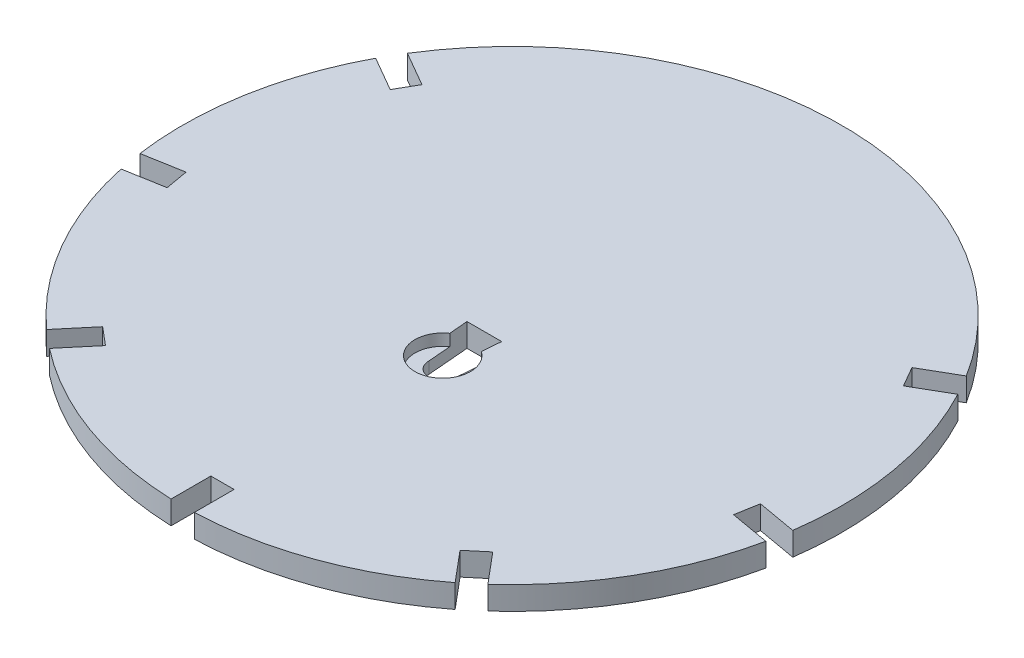
ISO-10303-21;
HEADER;
FILE_DESCRIPTION(('STEP AP214'),'2;1');
FILE_NAME('part.step','',(''),(''),'','','');
FILE_SCHEMA(('AUTOMOTIVE_DESIGN { 1 0 10303 214 1 1 1 1 }'));
ENDSEC;
DATA;
#1=APPLICATION_CONTEXT('core data for automotive mechanical design processes');
#2=APPLICATION_PROTOCOL_DEFINITION('international standard','automotive_design',2000,#1);
#3=PRODUCT_CONTEXT('',#1,'mechanical');
#4=PRODUCT('Part','Part','',(#3));
#5=PRODUCT_RELATED_PRODUCT_CATEGORY('part','',(#4));
#6=PRODUCT_DEFINITION_FORMATION('','',#4);
#7=PRODUCT_DEFINITION_CONTEXT('part definition',#1,'design');
#8=PRODUCT_DEFINITION('design','',#6,#7);
#9=PRODUCT_DEFINITION_SHAPE('','',#8);
#10=(LENGTH_UNIT() NAMED_UNIT(*) SI_UNIT(.MILLI.,.METRE.));
#11=(NAMED_UNIT(*) PLANE_ANGLE_UNIT() SI_UNIT($,.RADIAN.));
#12=(NAMED_UNIT(*) SI_UNIT($,.STERADIAN.) SOLID_ANGLE_UNIT());
#13=UNCERTAINTY_MEASURE_WITH_UNIT(LENGTH_MEASURE(1.E-05),#10,'distance_accuracy_value','');
#14=(GEOMETRIC_REPRESENTATION_CONTEXT(3) GLOBAL_UNCERTAINTY_ASSIGNED_CONTEXT((#13)) GLOBAL_UNIT_ASSIGNED_CONTEXT((#10,
#11,#12)) REPRESENTATION_CONTEXT('',''));
#15=CARTESIAN_POINT('',(0.,0.,0.));
#16=DIRECTION('',(0.,0.,1.));
#17=DIRECTION('',(1.,0.,0.));
#18=AXIS2_PLACEMENT_3D('',#15,#16,#17);
#19=CARTESIAN_POINT('',(0.,0.,20.));
#20=DIRECTION('',(0.,1.,0.));
#21=DIRECTION('',(0.,0.,1.));
#22=AXIS2_PLACEMENT_3D('',#19,#20,#21);
#23=CYLINDRICAL_SURFACE('',#22,4.);
#24=CARTESIAN_POINT('',(0.,3.35,20.));
#25=DIRECTION('',(0.,1.,0.));
#26=DIRECTION('',(0.,0.,1.));
#27=AXIS2_PLACEMENT_3D('',#24,#25,#26);
#28=CIRCLE('',#27,4.);
#29=CARTESIAN_POINT('',(4.,3.35,20.));
#30=VERTEX_POINT('',#29);
#31=CARTESIAN_POINT('',(-4.,3.35,20.));
#32=VERTEX_POINT('',#31);
#33=EDGE_CURVE('E48',#30,#32,#28,.F.);
#34=ORIENTED_EDGE('',*,*,#33,.F.);
#35=DIRECTION('',(0.,1.,0.));
#36=VECTOR('',#35,1.);
#37=CARTESIAN_POINT('',(4.,0.,20.));
#38=LINE('',#37,#36);
#39=CARTESIAN_POINT('',(4.,0.,20.));
#40=VERTEX_POINT('',#39);
#41=EDGE_CURVE('E268',#40,#30,#38,.T.);
#42=ORIENTED_EDGE('',*,*,#41,.F.);
#43=CARTESIAN_POINT('',(0.,0.,20.));
#44=DIRECTION('',(0.,1.,0.));
#45=DIRECTION('',(0.,0.,1.));
#46=AXIS2_PLACEMENT_3D('',#43,#44,#45);
#47=CIRCLE('',#46,4.);
#48=CARTESIAN_POINT('',(-4.,0.,20.));
#49=VERTEX_POINT('',#48);
#50=EDGE_CURVE('E283',#49,#40,#47,.T.);
#51=ORIENTED_EDGE('',*,*,#50,.F.);
#52=DIRECTION('',(0.,1.,0.));
#53=VECTOR('',#52,1.);
#54=CARTESIAN_POINT('',(-4.,0.,20.));
#55=LINE('',#54,#53);
#56=EDGE_CURVE('E464',#49,#32,#55,.T.);
#57=ORIENTED_EDGE('',*,*,#56,.T.);
#58=EDGE_LOOP('',(#34,#42,#51,#57));
#59=FACE_BOUND('',#58,.T.);
#60=ADVANCED_FACE('F33',(#59),#23,.F.);
#61=CARTESIAN_POINT('',(0.,6.7,0.));
#62=DIRECTION('',(0.,-1.,0.));
#63=DIRECTION('',(0.,0.,-1.));
#64=AXIS2_PLACEMENT_3D('',#61,#62,#63);
#65=CYLINDRICAL_SURFACE('',#64,95.);
#66=DIRECTION('',(0.,-1.,0.));
#67=VECTOR('',#66,1.);
#68=CARTESIAN_POINT('',(-58.4605954679749,6.7,74.8822994941381));
#69=LINE('',#68,#67);
#70=CARTESIAN_POINT('',(-58.4605954679749,0.,74.8822994941381));
#71=VERTEX_POINT('',#70);
#72=CARTESIAN_POINT('',(-58.4605954679749,6.7,74.8822994941381));
#73=VERTEX_POINT('',#72);
#74=EDGE_CURVE('E424',#71,#73,#69,.F.);
#75=ORIENTED_EDGE('',*,*,#74,.F.);
#76=CARTESIAN_POINT('',(0.,0.,0.));
#77=DIRECTION('',(0.,1.,0.));
#78=DIRECTION('',(0.,0.,1.));
#79=AXIS2_PLACEMENT_3D('',#76,#77,#78);
#80=CIRCLE('',#79,95.);
#81=CARTESIAN_POINT('',(-3.35000000000002,0.,94.9409158371669));
#82=VERTEX_POINT('',#81);
#83=EDGE_CURVE('E602',#71,#82,#80,.T.);
#84=ORIENTED_EDGE('',*,*,#83,.T.);
#85=DIRECTION('',(0.,-1.,0.));
#86=VECTOR('',#85,1.);
#87=CARTESIAN_POINT('',(-3.35000000000002,6.7,94.9409158371669));
#88=LINE('',#87,#86);
#89=CARTESIAN_POINT('',(-3.35000000000002,6.7,94.9409158371669));
#90=VERTEX_POINT('',#89);
#91=EDGE_CURVE('E406',#82,#90,#88,.F.);
#92=ORIENTED_EDGE('',*,*,#91,.T.);
#93=CARTESIAN_POINT('',(0.,6.7,0.));
#94=DIRECTION('',(0.,1.,0.));
#95=DIRECTION('',(0.,0.,1.));
#96=AXIS2_PLACEMENT_3D('',#93,#94,#95);
#97=CIRCLE('',#96,95.);
#98=EDGE_CURVE('E607',#73,#90,#97,.T.);
#99=ORIENTED_EDGE('',*,*,#98,.F.);
#100=EDGE_LOOP('',(#75,#84,#92,#99));
#101=FACE_BOUND('',#100,.T.);
#102=ADVANCED_FACE('F506',(#101),#65,.T.);
#103=CARTESIAN_POINT('',(-92.9168285993373,0.,19.7854229937441));
#104=VERTEX_POINT('',#103);
#105=CARTESIAN_POINT('',(-63.5930932368721,0.,70.5756225092383));
#106=VERTEX_POINT('',#105);
#107=EDGE_CURVE('E641',#104,#106,#80,.T.);
#108=ORIENTED_EDGE('',*,*,#107,.T.);
#109=DIRECTION('',(0.,-1.,0.));
#110=VECTOR('',#109,1.);
#111=CARTESIAN_POINT('',(-63.5930932368721,6.7,70.5756225092383));
#112=LINE('',#111,#110);
#113=CARTESIAN_POINT('',(-63.5930932368721,6.7,70.5756225092383));
#114=VERTEX_POINT('',#113);
#115=EDGE_CURVE('E421',#106,#114,#112,.F.);
#116=ORIENTED_EDGE('',*,*,#115,.T.);
#117=CARTESIAN_POINT('',(-92.9168285993373,6.7,19.7854229937441));
#118=VERTEX_POINT('',#117);
#119=EDGE_CURVE('E609',#118,#114,#97,.T.);
#120=ORIENTED_EDGE('',*,*,#119,.F.);
#121=DIRECTION('',(0.,-1.,0.));
#122=VECTOR('',#121,1.);
#123=CARTESIAN_POINT('',(-92.9168285993373,6.7,19.7854229937441));
#124=LINE('',#123,#122);
#125=EDGE_CURVE('E419',#104,#118,#124,.F.);
#126=ORIENTED_EDGE('',*,*,#125,.F.);
#127=EDGE_LOOP('',(#108,#116,#120,#126));
#128=FACE_BOUND('',#127,.T.);
#129=ADVANCED_FACE('F511',(#128),#65,.T.);
#130=CARTESIAN_POINT('',(-83.8962449735466,0.,-44.569272815906));
#131=VERTEX_POINT('',#130);
#132=CARTESIAN_POINT('',(-94.0802713897057,0.,13.1872110485623));
#133=VERTEX_POINT('',#132);
#134=EDGE_CURVE('E460',#131,#133,#80,.T.);
#135=ORIENTED_EDGE('',*,*,#134,.T.);
#136=DIRECTION('',(0.,-1.,0.));
#137=VECTOR('',#136,1.);
#138=CARTESIAN_POINT('',(-94.0802713897057,6.7,13.1872110485623));
#139=LINE('',#138,#137);
#140=CARTESIAN_POINT('',(-94.0802713897057,6.7,13.1872110485623));
#141=VERTEX_POINT('',#140);
#142=EDGE_CURVE('E416',#133,#141,#139,.F.);
#143=ORIENTED_EDGE('',*,*,#142,.T.);
#144=CARTESIAN_POINT('',(-83.8962449735466,6.7,-44.569272815906));
#145=VERTEX_POINT('',#144);
#146=EDGE_CURVE('E456',#145,#141,#97,.T.);
#147=ORIENTED_EDGE('',*,*,#146,.F.);
#148=DIRECTION('',(0.,-1.,0.));
#149=VECTOR('',#148,1.);
#150=CARTESIAN_POINT('',(-83.8962449735466,6.7,-44.569272815906));
#151=LINE('',#150,#149);
#152=EDGE_CURVE('E414',#131,#145,#151,.F.);
#153=ORIENTED_EDGE('',*,*,#152,.F.);
#154=EDGE_LOOP('',(#135,#143,#147,#153));
#155=FACE_BOUND('',#154,.T.);
#156=ADVANCED_FACE('F650',(#155),#65,.T.);
#157=DIRECTION('',(0.,-1.,0.));
#158=VECTOR('',#157,1.);
#159=CARTESIAN_POINT('',(3.34999999999998,6.7,94.9409158371669));
#160=LINE('',#159,#158);
#161=CARTESIAN_POINT('',(3.34999999999998,0.,94.9409158371669));
#162=VERTEX_POINT('',#161);
#163=CARTESIAN_POINT('',(3.34999999999998,6.7,94.9409158371669));
#164=VERTEX_POINT('',#163);
#165=EDGE_CURVE('E409',#162,#164,#160,.F.);
#166=ORIENTED_EDGE('',*,*,#165,.F.);
#167=CARTESIAN_POINT('',(58.4605954679749,0.,74.8822994941381));
#168=VERTEX_POINT('',#167);
#169=EDGE_CURVE('E633',#162,#168,#80,.T.);
#170=ORIENTED_EDGE('',*,*,#169,.T.);
#171=DIRECTION('',(0.,-1.,0.));
#172=VECTOR('',#171,1.);
#173=CARTESIAN_POINT('',(58.4605954679749,6.7,74.8822994941381));
#174=LINE('',#173,#172);
#175=CARTESIAN_POINT('',(58.4605954679749,6.7,74.8822994941381));
#176=VERTEX_POINT('',#175);
#177=EDGE_CURVE('E401',#168,#176,#174,.F.);
#178=ORIENTED_EDGE('',*,*,#177,.T.);
#179=EDGE_CURVE('E610',#164,#176,#97,.T.);
#180=ORIENTED_EDGE('',*,*,#179,.F.);
#181=EDGE_LOOP('',(#166,#170,#178,#180));
#182=FACE_BOUND('',#181,.T.);
#183=ADVANCED_FACE('F771',(#182),#65,.T.);
#184=DIRECTION('',(0.,-1.,0.));
#185=VECTOR('',#184,1.);
#186=CARTESIAN_POINT('',(63.5930932368721,6.7,70.5756225092383));
#187=LINE('',#186,#185);
#188=CARTESIAN_POINT('',(63.5930932368721,0.,70.5756225092383));
#189=VERTEX_POINT('',#188);
#190=CARTESIAN_POINT('',(63.5930932368721,6.7,70.5756225092383));
#191=VERTEX_POINT('',#190);
#192=EDGE_CURVE('E404',#189,#191,#187,.F.);
#193=ORIENTED_EDGE('',*,*,#192,.F.);
#194=CARTESIAN_POINT('',(92.9168285993373,0.,19.7854229937441));
#195=VERTEX_POINT('',#194);
#196=EDGE_CURVE('E631',#189,#195,#80,.T.);
#197=ORIENTED_EDGE('',*,*,#196,.T.);
#198=DIRECTION('',(0.,-1.,0.));
#199=VECTOR('',#198,1.);
#200=CARTESIAN_POINT('',(92.9168285993373,6.7,19.7854229937441));
#201=LINE('',#200,#199);
#202=CARTESIAN_POINT('',(92.9168285993373,6.7,19.7854229937441));
#203=VERTEX_POINT('',#202);
#204=EDGE_CURVE('E352',#195,#203,#201,.F.);
#205=ORIENTED_EDGE('',*,*,#204,.T.);
#206=EDGE_CURVE('E613',#191,#203,#97,.T.);
#207=ORIENTED_EDGE('',*,*,#206,.F.);
#208=EDGE_LOOP('',(#193,#197,#205,#207));
#209=FACE_BOUND('',#208,.T.);
#210=ADVANCED_FACE('F763',(#209),#65,.T.);
#211=DIRECTION('',(0.,-1.,0.));
#212=VECTOR('',#211,1.);
#213=CARTESIAN_POINT('',(94.0802713897057,6.7,13.1872110485623));
#214=LINE('',#213,#212);
#215=CARTESIAN_POINT('',(94.0802713897057,0.,13.1872110485623));
#216=VERTEX_POINT('',#215);
#217=CARTESIAN_POINT('',(94.0802713897057,6.7,13.1872110485623));
#218=VERTEX_POINT('',#217);
#219=EDGE_CURVE('E399',#216,#218,#214,.F.);
#220=ORIENTED_EDGE('',*,*,#219,.F.);
#221=CARTESIAN_POINT('',(83.8962449735466,0.,-44.5692728159059));
#222=VERTEX_POINT('',#221);
#223=EDGE_CURVE('E452',#216,#222,#80,.T.);
#224=ORIENTED_EDGE('',*,*,#223,.T.);
#225=DIRECTION('',(0.,-1.,0.));
#226=VECTOR('',#225,1.);
#227=CARTESIAN_POINT('',(83.8962449735466,6.7,-44.5692728159059));
#228=LINE('',#227,#226);
#229=CARTESIAN_POINT('',(83.8962449735466,6.7,-44.5692728159059));
#230=VERTEX_POINT('',#229);
#231=EDGE_CURVE('E447',#222,#230,#228,.F.);
#232=ORIENTED_EDGE('',*,*,#231,.T.);
#233=EDGE_CURVE('E457',#218,#230,#97,.T.);
#234=ORIENTED_EDGE('',*,*,#233,.F.);
#235=EDGE_LOOP('',(#220,#224,#232,#234));
#236=FACE_BOUND('',#235,.T.);
#237=ADVANCED_FACE('F590',(#236),#65,.T.);
#238=CARTESIAN_POINT('',(0.,6.7,0.));
#239=DIRECTION('',(0.,1.,0.));
#240=DIRECTION('',(0.,0.,1.));
#241=AXIS2_PLACEMENT_3D('',#238,#239,#240);
#242=PLANE('',#241);
#243=CARTESIAN_POINT('',(0.,6.7,20.));
#244=DIRECTION('',(0.,1.,0.));
#245=DIRECTION('',(0.,0.,1.));
#246=AXIS2_PLACEMENT_3D('',#243,#244,#245);
#247=CIRCLE('',#246,8.);
#248=CARTESIAN_POINT('',(-4.54843070393989,6.7,13.4188315527213));
#249=VERTEX_POINT('',#248);
#250=CARTESIAN_POINT('',(4.5484307039399,6.7,13.4188315527213));
#251=VERTEX_POINT('',#250);
#252=EDGE_CURVE('E254',#249,#251,#247,.T.);
#253=ORIENTED_EDGE('',*,*,#252,.F.);
#254=DIRECTION('',(-0.0830454798537401,0.,-0.99654575824488));
#255=VECTOR('',#254,1.);
#256=CARTESIAN_POINT('',(-4.,6.7,20.));
#257=LINE('',#256,#255);
#258=CARTESIAN_POINT('',(-5.,6.7,8.));
#259=VERTEX_POINT('',#258);
#260=EDGE_CURVE('E279',#249,#259,#257,.T.);
#261=ORIENTED_EDGE('',*,*,#260,.T.);
#262=DIRECTION('',(1.,0.,0.));
#263=VECTOR('',#262,1.);
#264=CARTESIAN_POINT('',(-5.,6.7,8.));
#265=LINE('',#264,#263);
#266=CARTESIAN_POINT('',(5.,6.7,8.));
#267=VERTEX_POINT('',#266);
#268=EDGE_CURVE('E274',#259,#267,#265,.T.);
#269=ORIENTED_EDGE('',*,*,#268,.T.);
#270=DIRECTION('',(0.0830454798537398,0.,-0.99654575824488));
#271=VECTOR('',#270,1.);
#272=CARTESIAN_POINT('',(4.,6.7,20.));
#273=LINE('',#272,#271);
#274=EDGE_CURVE('E56',#251,#267,#273,.T.);
#275=ORIENTED_EDGE('',*,*,#274,.F.);
#276=EDGE_LOOP('',(#253,#261,#269,#275));
#277=FACE_BOUND('',#276,.T.);
#278=DIRECTION('',(-0.766044443118978,0.,-0.642787609686539));
#279=VECTOR('',#278,1.);
#280=CARTESIAN_POINT('',(-51.0904468341354,6.7,66.0988983818065));
#281=LINE('',#280,#279);
#282=CARTESIAN_POINT('',(-51.0904468341354,6.7,66.0988983818065));
#283=VERTEX_POINT('',#282);
#284=CARTESIAN_POINT('',(-56.2229446030325,6.7,61.7922213969067));
#285=VERTEX_POINT('',#284);
#286=EDGE_CURVE('E307',#283,#285,#281,.T.);
#287=ORIENTED_EDGE('',*,*,#286,.F.);
#288=DIRECTION('',(-0.642787609686541,0.,0.766044443118977));
#289=VECTOR('',#288,1.);
#290=CARTESIAN_POINT('',(-51.0904468341354,6.7,66.0988983818065));
#291=LINE('',#290,#289);
#292=EDGE_CURVE('E301',#283,#73,#291,.T.);
#293=ORIENTED_EDGE('',*,*,#292,.T.);
#294=ORIENTED_EDGE('',*,*,#98,.T.);
#295=DIRECTION('',(0.,0.,1.));
#296=VECTOR('',#295,1.);
#297=CARTESIAN_POINT('',(-3.35000000000002,6.7,83.475));
#298=LINE('',#297,#296);
#299=CARTESIAN_POINT('',(-3.35000000000002,6.7,83.475));
#300=VERTEX_POINT('',#299);
#301=EDGE_CURVE('E386',#300,#90,#298,.T.);
#302=ORIENTED_EDGE('',*,*,#301,.F.);
#303=DIRECTION('',(-1.,0.,0.));
#304=VECTOR('',#303,1.);
#305=CARTESIAN_POINT('',(3.34999999999997,6.7,83.475));
#306=LINE('',#305,#304);
#307=CARTESIAN_POINT('',(3.34999999999997,6.7,83.475));
#308=VERTEX_POINT('',#307);
#309=EDGE_CURVE('E364',#308,#300,#306,.T.);
#310=ORIENTED_EDGE('',*,*,#309,.F.);
#311=DIRECTION('',(0.,0.,1.));
#312=VECTOR('',#311,1.);
#313=CARTESIAN_POINT('',(3.34999999999997,6.7,83.475));
#314=LINE('',#313,#312);
#315=EDGE_CURVE('E383',#308,#164,#314,.T.);
#316=ORIENTED_EDGE('',*,*,#315,.T.);
#317=ORIENTED_EDGE('',*,*,#179,.T.);
#318=DIRECTION('',(0.642787609686541,0.,0.766044443118977));
#319=VECTOR('',#318,1.);
#320=CARTESIAN_POINT('',(51.0904468341354,6.7,66.0988983818065));
#321=LINE('',#320,#319);
#322=CARTESIAN_POINT('',(51.0904468341354,6.7,66.0988983818065));
#323=VERTEX_POINT('',#322);
#324=EDGE_CURVE('E368',#323,#176,#321,.T.);
#325=ORIENTED_EDGE('',*,*,#324,.F.);
#326=DIRECTION('',(-0.766044443118978,0.,0.642787609686539));
#327=VECTOR('',#326,1.);
#328=CARTESIAN_POINT('',(56.2229446030325,6.7,61.7922213969067));
#329=LINE('',#328,#327);
#330=CARTESIAN_POINT('',(56.2229446030325,6.7,61.7922213969067));
#331=VERTEX_POINT('',#330);
#332=EDGE_CURVE('E342',#331,#323,#329,.T.);
#333=ORIENTED_EDGE('',*,*,#332,.F.);
#334=DIRECTION('',(0.642787609686541,0.,0.766044443118976));
#335=VECTOR('',#334,1.);
#336=CARTESIAN_POINT('',(56.2229446030325,6.7,61.7922213969067));
#337=LINE('',#336,#335);
#338=EDGE_CURVE('E365',#331,#191,#337,.T.);
#339=ORIENTED_EDGE('',*,*,#338,.T.);
#340=ORIENTED_EDGE('',*,*,#206,.T.);
#341=DIRECTION('',(0.984807753012209,0.,0.173648177666927));
#342=VECTOR('',#341,1.);
#343=CARTESIAN_POINT('',(81.6251057875099,6.7,17.7943876033377));
#344=LINE('',#343,#342);
#345=CARTESIAN_POINT('',(81.6251057875099,6.7,17.7943876033377));
#346=VERTEX_POINT('',#345);
#347=EDGE_CURVE('E346',#346,#203,#344,.T.);
#348=ORIENTED_EDGE('',*,*,#347,.F.);
#349=DIRECTION('',(-0.173648177666929,0.,0.984807753012208));
#350=VECTOR('',#349,1.);
#351=CARTESIAN_POINT('',(82.7885485778783,6.7,11.1961756581559));
#352=LINE('',#351,#350);
#353=CARTESIAN_POINT('',(82.7885485778783,6.7,11.1961756581559));
#354=VERTEX_POINT('',#353);
#355=EDGE_CURVE('E349',#354,#346,#352,.T.);
#356=ORIENTED_EDGE('',*,*,#355,.F.);
#357=DIRECTION('',(0.984807753012208,0.,0.173648177666927));
#358=VECTOR('',#357,1.);
#359=CARTESIAN_POINT('',(82.7885485778783,6.7,11.1961756581559));
#360=LINE('',#359,#358);
#361=EDGE_CURVE('E343',#354,#218,#360,.T.);
#362=ORIENTED_EDGE('',*,*,#361,.T.);
#363=ORIENTED_EDGE('',*,*,#233,.T.);
#364=DIRECTION('',(0.866025403784436,0.,-0.500000000000004));
#365=VECTOR('',#364,1.);
#366=CARTESIAN_POINT('',(73.9664705809058,6.7,-38.8363148973225));
#367=LINE('',#366,#365);
#368=CARTESIAN_POINT('',(73.9664705809058,6.7,-38.8363148973225));
#369=VERTEX_POINT('',#368);
#370=EDGE_CURVE('E439',#369,#230,#367,.T.);
#371=ORIENTED_EDGE('',*,*,#370,.F.);
#372=DIRECTION('',(0.500000000000003,0.,0.866025403784437));
#373=VECTOR('',#372,1.);
#374=CARTESIAN_POINT('',(70.6164705809058,6.7,-44.6386851026782));
#375=LINE('',#374,#373);
#376=CARTESIAN_POINT('',(70.6164705809058,6.7,-44.6386851026782));
#377=VERTEX_POINT('',#376);
#378=EDGE_CURVE('E430',#377,#369,#375,.T.);
#379=ORIENTED_EDGE('',*,*,#378,.F.);
#380=DIRECTION('',(0.866025403784436,0.,-0.500000000000004));
#381=VECTOR('',#380,1.);
#382=CARTESIAN_POINT('',(70.6164705809058,6.7,-44.6386851026782));
#383=LINE('',#382,#381);
#384=CARTESIAN_POINT('',(80.5462449735466,6.7,-50.3716430212617));
#385=VERTEX_POINT('',#384);
#386=EDGE_CURVE('E426',#377,#385,#383,.T.);
#387=ORIENTED_EDGE('',*,*,#386,.T.);
#388=CARTESIAN_POINT('',(-80.5462449735466,6.7,-50.3716430212617));
#389=VERTEX_POINT('',#388);
#390=EDGE_CURVE('E453',#385,#389,#97,.T.);
#391=ORIENTED_EDGE('',*,*,#390,.T.);
#392=DIRECTION('',(-0.866025403784436,0.,-0.500000000000004));
#393=VECTOR('',#392,1.);
#394=CARTESIAN_POINT('',(-70.6164705809058,6.7,-44.6386851026782));
#395=LINE('',#394,#393);
#396=CARTESIAN_POINT('',(-70.6164705809058,6.7,-44.6386851026782));
#397=VERTEX_POINT('',#396);
#398=EDGE_CURVE('E490',#397,#389,#395,.T.);
#399=ORIENTED_EDGE('',*,*,#398,.F.);
#400=DIRECTION('',(0.500000000000005,0.,-0.866025403784436));
#401=VECTOR('',#400,1.);
#402=CARTESIAN_POINT('',(-73.9664705809058,6.7,-38.8363148973225));
#403=LINE('',#402,#401);
#404=CARTESIAN_POINT('',(-73.9664705809058,6.7,-38.8363148973225));
#405=VERTEX_POINT('',#404);
#406=EDGE_CURVE('E322',#405,#397,#403,.T.);
#407=ORIENTED_EDGE('',*,*,#406,.F.);
#408=DIRECTION('',(-0.866025403784436,0.,-0.500000000000004));
#409=VECTOR('',#408,1.);
#410=CARTESIAN_POINT('',(-73.9664705809058,6.7,-38.8363148973225));
#411=LINE('',#410,#409);
#412=EDGE_CURVE('E482',#405,#145,#411,.T.);
#413=ORIENTED_EDGE('',*,*,#412,.T.);
#414=ORIENTED_EDGE('',*,*,#146,.T.);
#415=DIRECTION('',(-0.984807753012209,0.,0.173648177666928));
#416=VECTOR('',#415,1.);
#417=CARTESIAN_POINT('',(-82.7885485778783,6.7,11.1961756581559));
#418=LINE('',#417,#416);
#419=CARTESIAN_POINT('',(-82.7885485778783,6.7,11.1961756581559));
#420=VERTEX_POINT('',#419);
#421=EDGE_CURVE('E326',#420,#141,#418,.T.);
#422=ORIENTED_EDGE('',*,*,#421,.F.);
#423=DIRECTION('',(-0.173648177666927,0.,-0.984807753012209));
#424=VECTOR('',#423,1.);
#425=CARTESIAN_POINT('',(-81.6251057875099,6.7,17.7943876033377));
#426=LINE('',#425,#424);
#427=CARTESIAN_POINT('',(-81.6251057875099,6.7,17.7943876033377));
#428=VERTEX_POINT('',#427);
#429=EDGE_CURVE('E300',#428,#420,#426,.T.);
#430=ORIENTED_EDGE('',*,*,#429,.F.);
#431=DIRECTION('',(-0.984807753012209,0.,0.173648177666928));
#432=VECTOR('',#431,1.);
#433=CARTESIAN_POINT('',(-81.6251057875099,6.7,17.7943876033377));
#434=LINE('',#433,#432);
#435=EDGE_CURVE('E323',#428,#118,#434,.T.);
#436=ORIENTED_EDGE('',*,*,#435,.T.);
#437=ORIENTED_EDGE('',*,*,#119,.T.);
#438=DIRECTION('',(-0.64278760968654,0.,0.766044443118977));
#439=VECTOR('',#438,1.);
#440=CARTESIAN_POINT('',(-56.2229446030325,6.7,61.7922213969067));
#441=LINE('',#440,#439);
#442=EDGE_CURVE('E304',#285,#114,#441,.T.);
#443=ORIENTED_EDGE('',*,*,#442,.F.);
#444=EDGE_LOOP('',(#287,#293,#294,#302,#310,#316,#317,#325,#333,#339,#340,#348,#356,#362,#363,
#371,#379,#387,#391,#399,#407,#413,#414,#422,#430,#436,#437,#443));
#445=FACE_BOUND('',#444,.T.);
#446=ADVANCED_FACE('F271',(#277,#445),#242,.T.);
#447=CARTESIAN_POINT('',(0.,0.,0.));
#448=DIRECTION('',(0.,1.,0.));
#449=DIRECTION('',(0.,0.,1.));
#450=AXIS2_PLACEMENT_3D('',#447,#448,#449);
#451=PLANE('',#450);
#452=ORIENTED_EDGE('',*,*,#50,.T.);
#453=DIRECTION('',(0.0830454798537398,0.,-0.99654575824488));
#454=VECTOR('',#453,1.);
#455=CARTESIAN_POINT('',(4.,0.,20.));
#456=LINE('',#455,#454);
#457=CARTESIAN_POINT('',(5.,0.,8.));
#458=VERTEX_POINT('',#457);
#459=EDGE_CURVE('E292',#40,#458,#456,.T.);
#460=ORIENTED_EDGE('',*,*,#459,.T.);
#461=DIRECTION('',(1.,0.,0.));
#462=VECTOR('',#461,1.);
#463=CARTESIAN_POINT('',(-5.,0.,8.));
#464=LINE('',#463,#462);
#465=CARTESIAN_POINT('',(-5.,0.,8.));
#466=VERTEX_POINT('',#465);
#467=EDGE_CURVE('E290',#466,#458,#464,.T.);
#468=ORIENTED_EDGE('',*,*,#467,.F.);
#469=DIRECTION('',(-0.0830454798537401,0.,-0.99654575824488));
#470=VECTOR('',#469,1.);
#471=CARTESIAN_POINT('',(-4.,0.,20.));
#472=LINE('',#471,#470);
#473=EDGE_CURVE('E286',#49,#466,#472,.T.);
#474=ORIENTED_EDGE('',*,*,#473,.F.);
#475=EDGE_LOOP('',(#452,#460,#468,#474));
#476=FACE_BOUND('',#475,.T.);
#477=DIRECTION('',(-0.642787609686541,0.,0.766044443118977));
#478=VECTOR('',#477,1.);
#479=CARTESIAN_POINT('',(-51.0904468341354,0.,66.0988983818065));
#480=LINE('',#479,#478);
#481=CARTESIAN_POINT('',(-51.0904468341354,0.,66.0988983818065));
#482=VERTEX_POINT('',#481);
#483=EDGE_CURVE('E297',#482,#71,#480,.T.);
#484=ORIENTED_EDGE('',*,*,#483,.F.);
#485=DIRECTION('',(-0.766044443118978,0.,-0.642787609686539));
#486=VECTOR('',#485,1.);
#487=CARTESIAN_POINT('',(-51.0904468341354,0.,66.0988983818065));
#488=LINE('',#487,#486);
#489=CARTESIAN_POINT('',(-56.2229446030325,0.,61.7922213969067));
#490=VERTEX_POINT('',#489);
#491=EDGE_CURVE('E305',#482,#490,#488,.T.);
#492=ORIENTED_EDGE('',*,*,#491,.T.);
#493=DIRECTION('',(-0.64278760968654,0.,0.766044443118977));
#494=VECTOR('',#493,1.);
#495=CARTESIAN_POINT('',(-56.2229446030325,0.,61.7922213969067));
#496=LINE('',#495,#494);
#497=EDGE_CURVE('E312',#490,#106,#496,.T.);
#498=ORIENTED_EDGE('',*,*,#497,.T.);
#499=ORIENTED_EDGE('',*,*,#107,.F.);
#500=DIRECTION('',(-0.984807753012209,0.,0.173648177666928));
#501=VECTOR('',#500,1.);
#502=CARTESIAN_POINT('',(-81.6251057875099,0.,17.7943876033377));
#503=LINE('',#502,#501);
#504=CARTESIAN_POINT('',(-81.6251057875099,0.,17.7943876033377));
#505=VERTEX_POINT('',#504);
#506=EDGE_CURVE('E319',#505,#104,#503,.T.);
#507=ORIENTED_EDGE('',*,*,#506,.F.);
#508=DIRECTION('',(-0.173648177666927,0.,-0.984807753012209));
#509=VECTOR('',#508,1.);
#510=CARTESIAN_POINT('',(-81.6251057875099,0.,17.7943876033377));
#511=LINE('',#510,#509);
#512=CARTESIAN_POINT('',(-82.7885485778783,0.,11.1961756581559));
#513=VERTEX_POINT('',#512);
#514=EDGE_CURVE('E327',#505,#513,#511,.T.);
#515=ORIENTED_EDGE('',*,*,#514,.T.);
#516=DIRECTION('',(-0.984807753012209,0.,0.173648177666928));
#517=VECTOR('',#516,1.);
#518=CARTESIAN_POINT('',(-82.7885485778783,0.,11.1961756581559));
#519=LINE('',#518,#517);
#520=EDGE_CURVE('E332',#513,#133,#519,.T.);
#521=ORIENTED_EDGE('',*,*,#520,.T.);
#522=ORIENTED_EDGE('',*,*,#134,.F.);
#523=DIRECTION('',(-0.866025403784436,0.,-0.500000000000004));
#524=VECTOR('',#523,1.);
#525=CARTESIAN_POINT('',(-73.9664705809058,0.,-38.8363148973225));
#526=LINE('',#525,#524);
#527=CARTESIAN_POINT('',(-73.9664705809058,0.,-38.8363148973225));
#528=VERTEX_POINT('',#527);
#529=EDGE_CURVE('E486',#528,#131,#526,.T.);
#530=ORIENTED_EDGE('',*,*,#529,.F.);
#531=DIRECTION('',(0.500000000000005,0.,-0.866025403784436));
#532=VECTOR('',#531,1.);
#533=CARTESIAN_POINT('',(-73.9664705809058,0.,-38.8363148973225));
#534=LINE('',#533,#532);
#535=CARTESIAN_POINT('',(-70.6164705809058,0.,-44.6386851026782));
#536=VERTEX_POINT('',#535);
#537=EDGE_CURVE('E479',#528,#536,#534,.T.);
#538=ORIENTED_EDGE('',*,*,#537,.T.);
#539=DIRECTION('',(-0.866025403784436,0.,-0.500000000000004));
#540=VECTOR('',#539,1.);
#541=CARTESIAN_POINT('',(-70.6164705809058,0.,-44.6386851026782));
#542=LINE('',#541,#540);
#543=CARTESIAN_POINT('',(-80.5462449735466,0.,-50.3716430212617));
#544=VERTEX_POINT('',#543);
#545=EDGE_CURVE('E483',#536,#544,#542,.T.);
#546=ORIENTED_EDGE('',*,*,#545,.T.);
#547=CARTESIAN_POINT('',(80.5462449735466,0.,-50.3716430212617));
#548=VERTEX_POINT('',#547);
#549=EDGE_CURVE('E458',#548,#544,#80,.T.);
#550=ORIENTED_EDGE('',*,*,#549,.F.);
#551=DIRECTION('',(0.866025403784436,0.,-0.500000000000004));
#552=VECTOR('',#551,1.);
#553=CARTESIAN_POINT('',(70.6164705809058,0.,-44.6386851026782));
#554=LINE('',#553,#552);
#555=CARTESIAN_POINT('',(70.6164705809058,0.,-44.6386851026782));
#556=VERTEX_POINT('',#555);
#557=EDGE_CURVE('E427',#556,#548,#554,.T.);
#558=ORIENTED_EDGE('',*,*,#557,.F.);
#559=DIRECTION('',(0.500000000000003,0.,0.866025403784437));
#560=VECTOR('',#559,1.);
#561=CARTESIAN_POINT('',(70.6164705809058,0.,-44.6386851026782));
#562=LINE('',#561,#560);
#563=CARTESIAN_POINT('',(73.9664705809058,0.,-38.8363148973225));
#564=VERTEX_POINT('',#563);
#565=EDGE_CURVE('E433',#556,#564,#562,.T.);
#566=ORIENTED_EDGE('',*,*,#565,.T.);
#567=DIRECTION('',(0.866025403784436,0.,-0.500000000000004));
#568=VECTOR('',#567,1.);
#569=CARTESIAN_POINT('',(73.9664705809058,0.,-38.8363148973225));
#570=LINE('',#569,#568);
#571=EDGE_CURVE('E429',#564,#222,#570,.T.);
#572=ORIENTED_EDGE('',*,*,#571,.T.);
#573=ORIENTED_EDGE('',*,*,#223,.F.);
#574=DIRECTION('',(0.984807753012208,0.,0.173648177666927));
#575=VECTOR('',#574,1.);
#576=CARTESIAN_POINT('',(82.7885485778783,0.,11.1961756581559));
#577=LINE('',#576,#575);
#578=CARTESIAN_POINT('',(82.7885485778783,0.,11.1961756581559));
#579=VERTEX_POINT('',#578);
#580=EDGE_CURVE('E339',#579,#216,#577,.T.);
#581=ORIENTED_EDGE('',*,*,#580,.F.);
#582=DIRECTION('',(-0.173648177666929,0.,0.984807753012208));
#583=VECTOR('',#582,1.);
#584=CARTESIAN_POINT('',(82.7885485778783,0.,11.1961756581559));
#585=LINE('',#584,#583);
#586=CARTESIAN_POINT('',(81.6251057875099,0.,17.7943876033377));
#587=VERTEX_POINT('',#586);
#588=EDGE_CURVE('E347',#579,#587,#585,.T.);
#589=ORIENTED_EDGE('',*,*,#588,.T.);
#590=DIRECTION('',(0.984807753012209,0.,0.173648177666927));
#591=VECTOR('',#590,1.);
#592=CARTESIAN_POINT('',(81.6251057875099,0.,17.7943876033377));
#593=LINE('',#592,#591);
#594=EDGE_CURVE('E354',#587,#195,#593,.T.);
#595=ORIENTED_EDGE('',*,*,#594,.T.);
#596=ORIENTED_EDGE('',*,*,#196,.F.);
#597=DIRECTION('',(0.642787609686541,0.,0.766044443118976));
#598=VECTOR('',#597,1.);
#599=CARTESIAN_POINT('',(56.2229446030325,0.,61.7922213969067));
#600=LINE('',#599,#598);
#601=CARTESIAN_POINT('',(56.2229446030325,0.,61.7922213969067));
#602=VERTEX_POINT('',#601);
#603=EDGE_CURVE('E361',#602,#189,#600,.T.);
#604=ORIENTED_EDGE('',*,*,#603,.F.);
#605=DIRECTION('',(-0.766044443118978,0.,0.642787609686539));
#606=VECTOR('',#605,1.);
#607=CARTESIAN_POINT('',(56.2229446030325,0.,61.7922213969067));
#608=LINE('',#607,#606);
#609=CARTESIAN_POINT('',(51.0904468341354,0.,66.0988983818065));
#610=VERTEX_POINT('',#609);
#611=EDGE_CURVE('E369',#602,#610,#608,.T.);
#612=ORIENTED_EDGE('',*,*,#611,.T.);
#613=DIRECTION('',(0.642787609686541,0.,0.766044443118977));
#614=VECTOR('',#613,1.);
#615=CARTESIAN_POINT('',(51.0904468341354,0.,66.0988983818065));
#616=LINE('',#615,#614);
#617=EDGE_CURVE('E374',#610,#168,#616,.T.);
#618=ORIENTED_EDGE('',*,*,#617,.T.);
#619=ORIENTED_EDGE('',*,*,#169,.F.);
#620=DIRECTION('',(0.,0.,1.));
#621=VECTOR('',#620,1.);
#622=CARTESIAN_POINT('',(3.34999999999997,0.,83.475));
#623=LINE('',#622,#621);
#624=CARTESIAN_POINT('',(3.34999999999997,0.,83.475));
#625=VERTEX_POINT('',#624);
#626=EDGE_CURVE('E381',#625,#162,#623,.T.);
#627=ORIENTED_EDGE('',*,*,#626,.F.);
#628=DIRECTION('',(-1.,0.,0.));
#629=VECTOR('',#628,1.);
#630=CARTESIAN_POINT('',(3.34999999999997,0.,83.475));
#631=LINE('',#630,#629);
#632=CARTESIAN_POINT('',(-3.35000000000002,0.,83.475));
#633=VERTEX_POINT('',#632);
#634=EDGE_CURVE('E387',#625,#633,#631,.T.);
#635=ORIENTED_EDGE('',*,*,#634,.T.);
#636=DIRECTION('',(0.,0.,1.));
#637=VECTOR('',#636,1.);
#638=CARTESIAN_POINT('',(-3.35000000000002,0.,83.475));
#639=LINE('',#638,#637);
#640=EDGE_CURVE('E392',#633,#82,#639,.T.);
#641=ORIENTED_EDGE('',*,*,#640,.T.);
#642=ORIENTED_EDGE('',*,*,#83,.F.);
#643=EDGE_LOOP('',(#484,#492,#498,#499,#507,#515,#521,#522,#530,#538,#546,#550,#558,#566,#572,
#573,#581,#589,#595,#596,#604,#612,#618,#619,#627,#635,#641,#642));
#644=FACE_BOUND('',#643,.T.);
#645=ADVANCED_FACE('F589',(#476,#644),#451,.F.);
#646=ORIENTED_EDGE('',*,*,#549,.T.);
#647=DIRECTION('',(0.,-1.,0.));
#648=VECTOR('',#647,1.);
#649=CARTESIAN_POINT('',(-80.5462449735466,6.7,-50.3716430212617));
#650=LINE('',#649,#648);
#651=EDGE_CURVE('E411',#544,#389,#650,.F.);
#652=ORIENTED_EDGE('',*,*,#651,.T.);
#653=ORIENTED_EDGE('',*,*,#390,.F.);
#654=DIRECTION('',(0.,-1.,0.));
#655=VECTOR('',#654,1.);
#656=CARTESIAN_POINT('',(80.5462449735466,6.7,-50.3716430212617));
#657=LINE('',#656,#655);
#658=EDGE_CURVE('E450',#548,#385,#657,.F.);
#659=ORIENTED_EDGE('',*,*,#658,.F.);
#660=EDGE_LOOP('',(#646,#652,#653,#659));
#661=FACE_BOUND('',#660,.T.);
#662=ADVANCED_FACE('F35',(#661),#65,.T.);
#663=CARTESIAN_POINT('',(70.6164705809058,0.,-44.6386851026782));
#664=DIRECTION('',(0.500000000000004,0.,0.866025403784436));
#665=DIRECTION('',(0.866025403784436,0.,-0.500000000000004));
#666=AXIS2_PLACEMENT_3D('',#663,#664,#665);
#667=PLANE('',#666);
#668=ORIENTED_EDGE('',*,*,#658,.T.);
#669=ORIENTED_EDGE('',*,*,#386,.F.);
#670=DIRECTION('',(0.,1.,0.));
#671=VECTOR('',#670,1.);
#672=CARTESIAN_POINT('',(70.6164705809058,0.,-44.6386851026782));
#673=LINE('',#672,#671);
#674=EDGE_CURVE('E436',#556,#377,#673,.T.);
#675=ORIENTED_EDGE('',*,*,#674,.F.);
#676=ORIENTED_EDGE('',*,*,#557,.T.);
#677=EDGE_LOOP('',(#668,#669,#675,#676));
#678=FACE_BOUND('',#677,.T.);
#679=ADVANCED_FACE('F583',(#678),#667,.T.);
#680=CARTESIAN_POINT('',(73.9664705809058,0.,-38.8363148973225));
#681=DIRECTION('',(0.500000000000004,0.,0.866025403784436));
#682=DIRECTION('',(0.866025403784436,0.,-0.500000000000004));
#683=AXIS2_PLACEMENT_3D('',#680,#681,#682);
#684=PLANE('',#683);
#685=ORIENTED_EDGE('',*,*,#571,.F.);
#686=DIRECTION('',(0.,1.,0.));
#687=VECTOR('',#686,1.);
#688=CARTESIAN_POINT('',(73.9664705809058,0.,-38.8363148973225));
#689=LINE('',#688,#687);
#690=EDGE_CURVE('E445',#564,#369,#689,.T.);
#691=ORIENTED_EDGE('',*,*,#690,.T.);
#692=ORIENTED_EDGE('',*,*,#370,.T.);
#693=ORIENTED_EDGE('',*,*,#231,.F.);
#694=EDGE_LOOP('',(#685,#691,#692,#693));
#695=FACE_BOUND('',#694,.T.);
#696=ADVANCED_FACE('F579',(#695),#684,.F.);
#697=CARTESIAN_POINT('',(70.6164705809058,0.,-44.6386851026782));
#698=DIRECTION('',(-0.866025403784437,0.,0.500000000000003));
#699=DIRECTION('',(0.500000000000003,0.,0.866025403784437));
#700=AXIS2_PLACEMENT_3D('',#697,#698,#699);
#701=PLANE('',#700);
#702=ORIENTED_EDGE('',*,*,#378,.T.);
#703=ORIENTED_EDGE('',*,*,#690,.F.);
#704=ORIENTED_EDGE('',*,*,#565,.F.);
#705=ORIENTED_EDGE('',*,*,#674,.T.);
#706=EDGE_LOOP('',(#702,#703,#704,#705));
#707=FACE_BOUND('',#706,.T.);
#708=ADVANCED_FACE('F552',(#707),#701,.F.);
#709=CARTESIAN_POINT('',(82.7885485778783,0.,11.1961756581559));
#710=DIRECTION('',(-0.173648177666927,0.,0.984807753012209));
#711=DIRECTION('',(0.984807753012209,0.,0.173648177666927));
#712=AXIS2_PLACEMENT_3D('',#709,#710,#711);
#713=PLANE('',#712);
#714=ORIENTED_EDGE('',*,*,#219,.T.);
#715=ORIENTED_EDGE('',*,*,#361,.F.);
#716=DIRECTION('',(0.,1.,0.));
#717=VECTOR('',#716,1.);
#718=CARTESIAN_POINT('',(82.7885485778783,0.,11.1961756581559));
#719=LINE('',#718,#717);
#720=EDGE_CURVE('E340',#579,#354,#719,.T.);
#721=ORIENTED_EDGE('',*,*,#720,.F.);
#722=ORIENTED_EDGE('',*,*,#580,.T.);
#723=EDGE_LOOP('',(#714,#715,#721,#722));
#724=FACE_BOUND('',#723,.T.);
#725=ADVANCED_FACE('F548',(#724),#713,.T.);
#726=CARTESIAN_POINT('',(81.6251057875099,0.,17.7943876033377));
#727=DIRECTION('',(-0.173648177666927,0.,0.984807753012209));
#728=DIRECTION('',(0.984807753012209,0.,0.173648177666927));
#729=AXIS2_PLACEMENT_3D('',#726,#727,#728);
#730=PLANE('',#729);
#731=ORIENTED_EDGE('',*,*,#594,.F.);
#732=DIRECTION('',(0.,1.,0.));
#733=VECTOR('',#732,1.);
#734=CARTESIAN_POINT('',(81.6251057875099,0.,17.7943876033377));
#735=LINE('',#734,#733);
#736=EDGE_CURVE('E337',#587,#346,#735,.T.);
#737=ORIENTED_EDGE('',*,*,#736,.T.);
#738=ORIENTED_EDGE('',*,*,#347,.T.);
#739=ORIENTED_EDGE('',*,*,#204,.F.);
#740=EDGE_LOOP('',(#731,#737,#738,#739));
#741=FACE_BOUND('',#740,.T.);
#742=ADVANCED_FACE('F544',(#741),#730,.F.);
#743=CARTESIAN_POINT('',(82.7885485778783,0.,11.1961756581559));
#744=DIRECTION('',(-0.984807753012208,0.,-0.173648177666929));
#745=DIRECTION('',(-0.173648177666929,0.,0.984807753012208));
#746=AXIS2_PLACEMENT_3D('',#743,#744,#745);
#747=PLANE('',#746);
#748=ORIENTED_EDGE('',*,*,#355,.T.);
#749=ORIENTED_EDGE('',*,*,#736,.F.);
#750=ORIENTED_EDGE('',*,*,#588,.F.);
#751=ORIENTED_EDGE('',*,*,#720,.T.);
#752=EDGE_LOOP('',(#748,#749,#750,#751));
#753=FACE_BOUND('',#752,.T.);
#754=ADVANCED_FACE('F540',(#753),#747,.F.);
#755=CARTESIAN_POINT('',(56.2229446030325,0.,61.7922213969067));
#756=DIRECTION('',(-0.766044443118977,0.,0.642787609686541));
#757=DIRECTION('',(0.642787609686541,0.,0.766044443118977));
#758=AXIS2_PLACEMENT_3D('',#755,#756,#757);
#759=PLANE('',#758);
#760=ORIENTED_EDGE('',*,*,#192,.T.);
#761=ORIENTED_EDGE('',*,*,#338,.F.);
#762=DIRECTION('',(0.,1.,0.));
#763=VECTOR('',#762,1.);
#764=CARTESIAN_POINT('',(56.2229446030325,0.,61.7922213969067));
#765=LINE('',#764,#763);
#766=EDGE_CURVE('E362',#602,#331,#765,.T.);
#767=ORIENTED_EDGE('',*,*,#766,.F.);
#768=ORIENTED_EDGE('',*,*,#603,.T.);
#769=EDGE_LOOP('',(#760,#761,#767,#768));
#770=FACE_BOUND('',#769,.T.);
#771=ADVANCED_FACE('F543',(#770),#759,.T.);
#772=CARTESIAN_POINT('',(51.0904468341354,0.,66.0988983818065));
#773=DIRECTION('',(-0.766044443118977,0.,0.642787609686541));
#774=DIRECTION('',(0.642787609686541,0.,0.766044443118977));
#775=AXIS2_PLACEMENT_3D('',#772,#773,#774);
#776=PLANE('',#775);
#777=ORIENTED_EDGE('',*,*,#617,.F.);
#778=DIRECTION('',(0.,1.,0.));
#779=VECTOR('',#778,1.);
#780=CARTESIAN_POINT('',(51.0904468341354,0.,66.0988983818065));
#781=LINE('',#780,#779);
#782=EDGE_CURVE('E359',#610,#323,#781,.T.);
#783=ORIENTED_EDGE('',*,*,#782,.T.);
#784=ORIENTED_EDGE('',*,*,#324,.T.);
#785=ORIENTED_EDGE('',*,*,#177,.F.);
#786=EDGE_LOOP('',(#777,#783,#784,#785));
#787=FACE_BOUND('',#786,.T.);
#788=ADVANCED_FACE('F558',(#787),#776,.F.);
#789=CARTESIAN_POINT('',(56.2229446030325,0.,61.7922213969067));
#790=DIRECTION('',(-0.642787609686539,0.,-0.766044443118978));
#791=DIRECTION('',(-0.766044443118978,0.,0.642787609686539));
#792=AXIS2_PLACEMENT_3D('',#789,#790,#791);
#793=PLANE('',#792);
#794=ORIENTED_EDGE('',*,*,#332,.T.);
#795=ORIENTED_EDGE('',*,*,#782,.F.);
#796=ORIENTED_EDGE('',*,*,#611,.F.);
#797=ORIENTED_EDGE('',*,*,#766,.T.);
#798=EDGE_LOOP('',(#794,#795,#796,#797));
#799=FACE_BOUND('',#798,.T.);
#800=ADVANCED_FACE('F554',(#799),#793,.F.);
#801=CARTESIAN_POINT('',(3.34999999999997,0.,83.475));
#802=DIRECTION('',(-1.,0.,0.));
#803=DIRECTION('',(0.,0.,1.));
#804=AXIS2_PLACEMENT_3D('',#801,#802,#803);
#805=PLANE('',#804);
#806=ORIENTED_EDGE('',*,*,#165,.T.);
#807=ORIENTED_EDGE('',*,*,#315,.F.);
#808=DIRECTION('',(0.,1.,0.));
#809=VECTOR('',#808,1.);
#810=CARTESIAN_POINT('',(3.34999999999997,0.,83.475));
#811=LINE('',#810,#809);
#812=EDGE_CURVE('E310',#625,#308,#811,.T.);
#813=ORIENTED_EDGE('',*,*,#812,.F.);
#814=ORIENTED_EDGE('',*,*,#626,.T.);
#815=EDGE_LOOP('',(#806,#807,#813,#814));
#816=FACE_BOUND('',#815,.T.);
#817=ADVANCED_FACE('F557',(#816),#805,.T.);
#818=CARTESIAN_POINT('',(-3.35000000000002,0.,83.475));
#819=DIRECTION('',(-1.,0.,0.));
#820=DIRECTION('',(0.,0.,1.));
#821=AXIS2_PLACEMENT_3D('',#818,#819,#820);
#822=PLANE('',#821);
#823=ORIENTED_EDGE('',*,*,#640,.F.);
#824=DIRECTION('',(0.,1.,0.));
#825=VECTOR('',#824,1.);
#826=CARTESIAN_POINT('',(-3.35000000000002,0.,83.475));
#827=LINE('',#826,#825);
#828=EDGE_CURVE('E379',#633,#300,#827,.T.);
#829=ORIENTED_EDGE('',*,*,#828,.T.);
#830=ORIENTED_EDGE('',*,*,#301,.T.);
#831=ORIENTED_EDGE('',*,*,#91,.F.);
#832=EDGE_LOOP('',(#823,#829,#830,#831));
#833=FACE_BOUND('',#832,.T.);
#834=ADVANCED_FACE('F569',(#833),#822,.F.);
#835=CARTESIAN_POINT('',(3.34999999999997,0.,83.475));
#836=DIRECTION('',(0.,0.,-1.));
#837=DIRECTION('',(-1.,0.,0.));
#838=AXIS2_PLACEMENT_3D('',#835,#836,#837);
#839=PLANE('',#838);
#840=ORIENTED_EDGE('',*,*,#309,.T.);
#841=ORIENTED_EDGE('',*,*,#828,.F.);
#842=ORIENTED_EDGE('',*,*,#634,.F.);
#843=ORIENTED_EDGE('',*,*,#812,.T.);
#844=EDGE_LOOP('',(#840,#841,#842,#843));
#845=FACE_BOUND('',#844,.T.);
#846=ADVANCED_FACE('F566',(#845),#839,.F.);
#847=CARTESIAN_POINT('',(4.,0.,20.));
#848=DIRECTION('',(0.99654575824488,0.,0.0830454798537398));
#849=DIRECTION('',(0.0830454798537398,0.,-0.99654575824488));
#850=AXIS2_PLACEMENT_3D('',#847,#848,#849);
#851=PLANE('',#850);
#852=DIRECTION('',(-0.0830454798537398,0.,0.99654575824488));
#853=VECTOR('',#852,1.);
#854=CARTESIAN_POINT('',(4.,3.35,20.));
#855=LINE('',#854,#853);
#856=CARTESIAN_POINT('',(4.5484307039399,3.35,13.4188315527213));
#857=VERTEX_POINT('',#856);
#858=EDGE_CURVE('E267',#857,#30,#855,.T.);
#859=ORIENTED_EDGE('',*,*,#858,.F.);
#860=DIRECTION('',(0.,1.,0.));
#861=VECTOR('',#860,1.);
#862=CARTESIAN_POINT('',(4.5484307039399,3.35,13.4188315527213));
#863=LINE('',#862,#861);
#864=EDGE_CURVE('E257',#857,#251,#863,.T.);
#865=ORIENTED_EDGE('',*,*,#864,.T.);
#866=ORIENTED_EDGE('',*,*,#274,.T.);
#867=DIRECTION('',(0.,1.,0.));
#868=VECTOR('',#867,1.);
#869=CARTESIAN_POINT('',(5.,0.,8.));
#870=LINE('',#869,#868);
#871=EDGE_CURVE('E287',#458,#267,#870,.T.);
#872=ORIENTED_EDGE('',*,*,#871,.F.);
#873=ORIENTED_EDGE('',*,*,#459,.F.);
#874=ORIENTED_EDGE('',*,*,#41,.T.);
#875=EDGE_LOOP('',(#859,#865,#866,#872,#873,#874));
#876=FACE_BOUND('',#875,.T.);
#877=ADVANCED_FACE('F265',(#876),#851,.F.);
#878=CARTESIAN_POINT('',(-4.,0.,20.));
#879=DIRECTION('',(0.99654575824488,0.,-0.0830454798537401));
#880=DIRECTION('',(-0.0830454798537401,0.,-0.99654575824488));
#881=AXIS2_PLACEMENT_3D('',#878,#879,#880);
#882=PLANE('',#881);
#883=DIRECTION('',(0.,1.,0.));
#884=VECTOR('',#883,1.);
#885=CARTESIAN_POINT('',(-4.54843070393989,3.35,13.4188315527213));
#886=LINE('',#885,#884);
#887=CARTESIAN_POINT('',(-4.54843070393989,3.35,13.4188315527213));
#888=VERTEX_POINT('',#887);
#889=EDGE_CURVE('E11',#888,#249,#886,.T.);
#890=ORIENTED_EDGE('',*,*,#889,.F.);
#891=DIRECTION('',(0.0830454798537401,0.,0.99654575824488));
#892=VECTOR('',#891,1.);
#893=CARTESIAN_POINT('',(-4.,3.35,20.));
#894=LINE('',#893,#892);
#895=EDGE_CURVE('E41',#888,#32,#894,.T.);
#896=ORIENTED_EDGE('',*,*,#895,.T.);
#897=ORIENTED_EDGE('',*,*,#56,.F.);
#898=ORIENTED_EDGE('',*,*,#473,.T.);
#899=DIRECTION('',(0.,1.,0.));
#900=VECTOR('',#899,1.);
#901=CARTESIAN_POINT('',(-5.,0.,8.));
#902=LINE('',#901,#900);
#903=EDGE_CURVE('E468',#466,#259,#902,.T.);
#904=ORIENTED_EDGE('',*,*,#903,.T.);
#905=ORIENTED_EDGE('',*,*,#260,.F.);
#906=EDGE_LOOP('',(#890,#896,#897,#898,#904,#905));
#907=FACE_BOUND('',#906,.T.);
#908=ADVANCED_FACE('F463',(#907),#882,.T.);
#909=CARTESIAN_POINT('',(-5.,0.,8.));
#910=DIRECTION('',(0.,0.,1.));
#911=DIRECTION('',(1.,0.,0.));
#912=AXIS2_PLACEMENT_3D('',#909,#910,#911);
#913=PLANE('',#912);
#914=ORIENTED_EDGE('',*,*,#268,.F.);
#915=ORIENTED_EDGE('',*,*,#903,.F.);
#916=ORIENTED_EDGE('',*,*,#467,.T.);
#917=ORIENTED_EDGE('',*,*,#871,.T.);
#918=EDGE_LOOP('',(#914,#915,#916,#917));
#919=FACE_BOUND('',#918,.T.);
#920=ADVANCED_FACE('F476',(#919),#913,.T.);
#921=CARTESIAN_POINT('',(-73.9664705809058,0.,-38.8363148973225));
#922=DIRECTION('',(0.500000000000004,0.,-0.866025403784436));
#923=DIRECTION('',(-0.866025403784436,0.,-0.500000000000004));
#924=AXIS2_PLACEMENT_3D('',#921,#922,#923);
#925=PLANE('',#924);
#926=ORIENTED_EDGE('',*,*,#152,.T.);
#927=ORIENTED_EDGE('',*,*,#412,.F.);
#928=DIRECTION('',(0.,1.,0.));
#929=VECTOR('',#928,1.);
#930=CARTESIAN_POINT('',(-73.9664705809058,0.,-38.8363148973225));
#931=LINE('',#930,#929);
#932=EDGE_CURVE('E275',#528,#405,#931,.T.);
#933=ORIENTED_EDGE('',*,*,#932,.F.);
#934=ORIENTED_EDGE('',*,*,#529,.T.);
#935=EDGE_LOOP('',(#926,#927,#933,#934));
#936=FACE_BOUND('',#935,.T.);
#937=ADVANCED_FACE('F663',(#936),#925,.T.);
#938=CARTESIAN_POINT('',(-70.6164705809058,0.,-44.6386851026782));
#939=DIRECTION('',(0.500000000000004,0.,-0.866025403784436));
#940=DIRECTION('',(-0.866025403784436,0.,-0.500000000000004));
#941=AXIS2_PLACEMENT_3D('',#938,#939,#940);
#942=PLANE('',#941);
#943=ORIENTED_EDGE('',*,*,#545,.F.);
#944=DIRECTION('',(0.,1.,0.));
#945=VECTOR('',#944,1.);
#946=CARTESIAN_POINT('',(-70.6164705809058,0.,-44.6386851026782));
#947=LINE('',#946,#945);
#948=EDGE_CURVE('E277',#536,#397,#947,.T.);
#949=ORIENTED_EDGE('',*,*,#948,.T.);
#950=ORIENTED_EDGE('',*,*,#398,.T.);
#951=ORIENTED_EDGE('',*,*,#651,.F.);
#952=EDGE_LOOP('',(#943,#949,#950,#951));
#953=FACE_BOUND('',#952,.T.);
#954=ADVANCED_FACE('F674',(#953),#942,.F.);
#955=CARTESIAN_POINT('',(-73.9664705809058,0.,-38.8363148973225));
#956=DIRECTION('',(0.866025403784436,0.,0.500000000000005));
#957=DIRECTION('',(0.500000000000005,0.,-0.866025403784436));
#958=AXIS2_PLACEMENT_3D('',#955,#956,#957);
#959=PLANE('',#958);
#960=ORIENTED_EDGE('',*,*,#406,.T.);
#961=ORIENTED_EDGE('',*,*,#948,.F.);
#962=ORIENTED_EDGE('',*,*,#537,.F.);
#963=ORIENTED_EDGE('',*,*,#932,.T.);
#964=EDGE_LOOP('',(#960,#961,#962,#963));
#965=FACE_BOUND('',#964,.T.);
#966=ADVANCED_FACE('F538',(#965),#959,.F.);
#967=CARTESIAN_POINT('',(-81.6251057875099,0.,17.7943876033377));
#968=DIRECTION('',(-0.173648177666928,0.,-0.984807753012209));
#969=DIRECTION('',(-0.984807753012209,0.,0.173648177666928));
#970=AXIS2_PLACEMENT_3D('',#967,#968,#969);
#971=PLANE('',#970);
#972=ORIENTED_EDGE('',*,*,#125,.T.);
#973=ORIENTED_EDGE('',*,*,#435,.F.);
#974=DIRECTION('',(0.,1.,0.));
#975=VECTOR('',#974,1.);
#976=CARTESIAN_POINT('',(-81.6251057875099,0.,17.7943876033377));
#977=LINE('',#976,#975);
#978=EDGE_CURVE('E320',#505,#428,#977,.T.);
#979=ORIENTED_EDGE('',*,*,#978,.F.);
#980=ORIENTED_EDGE('',*,*,#506,.T.);
#981=EDGE_LOOP('',(#972,#973,#979,#980));
#982=FACE_BOUND('',#981,.T.);
#983=ADVANCED_FACE('F534',(#982),#971,.T.);
#984=CARTESIAN_POINT('',(-82.7885485778783,0.,11.1961756581559));
#985=DIRECTION('',(-0.173648177666928,0.,-0.984807753012208));
#986=DIRECTION('',(-0.984807753012209,0.,0.173648177666928));
#987=AXIS2_PLACEMENT_3D('',#984,#985,#986);
#988=PLANE('',#987);
#989=ORIENTED_EDGE('',*,*,#520,.F.);
#990=DIRECTION('',(0.,1.,0.));
#991=VECTOR('',#990,1.);
#992=CARTESIAN_POINT('',(-82.7885485778783,0.,11.1961756581559));
#993=LINE('',#992,#991);
#994=EDGE_CURVE('E317',#513,#420,#993,.T.);
#995=ORIENTED_EDGE('',*,*,#994,.T.);
#996=ORIENTED_EDGE('',*,*,#421,.T.);
#997=ORIENTED_EDGE('',*,*,#142,.F.);
#998=EDGE_LOOP('',(#989,#995,#996,#997));
#999=FACE_BOUND('',#998,.T.);
#1000=ADVANCED_FACE('F530',(#999),#988,.F.);
#1001=CARTESIAN_POINT('',(-81.6251057875099,0.,17.7943876033377));
#1002=DIRECTION('',(0.984807753012209,0.,-0.173648177666927));
#1003=DIRECTION('',(-0.173648177666927,0.,-0.984807753012209));
#1004=AXIS2_PLACEMENT_3D('',#1001,#1002,#1003);
#1005=PLANE('',#1004);
#1006=ORIENTED_EDGE('',*,*,#429,.T.);
#1007=ORIENTED_EDGE('',*,*,#994,.F.);
#1008=ORIENTED_EDGE('',*,*,#514,.F.);
#1009=ORIENTED_EDGE('',*,*,#978,.T.);
#1010=EDGE_LOOP('',(#1006,#1007,#1008,#1009));
#1011=FACE_BOUND('',#1010,.T.);
#1012=ADVANCED_FACE('F526',(#1011),#1005,.F.);
#1013=CARTESIAN_POINT('',(-51.0904468341354,0.,66.0988983818065));
#1014=DIRECTION('',(-0.766044443118977,0.,-0.642787609686541));
#1015=DIRECTION('',(-0.642787609686541,0.,0.766044443118977));
#1016=AXIS2_PLACEMENT_3D('',#1013,#1014,#1015);
#1017=PLANE('',#1016);
#1018=ORIENTED_EDGE('',*,*,#74,.T.);
#1019=ORIENTED_EDGE('',*,*,#292,.F.);
#1020=DIRECTION('',(0.,1.,0.));
#1021=VECTOR('',#1020,1.);
#1022=CARTESIAN_POINT('',(-51.0904468341354,0.,66.0988983818065));
#1023=LINE('',#1022,#1021);
#1024=EDGE_CURVE('E298',#482,#283,#1023,.T.);
#1025=ORIENTED_EDGE('',*,*,#1024,.F.);
#1026=ORIENTED_EDGE('',*,*,#483,.T.);
#1027=EDGE_LOOP('',(#1018,#1019,#1025,#1026));
#1028=FACE_BOUND('',#1027,.T.);
#1029=ADVANCED_FACE('F522',(#1028),#1017,.T.);
#1030=CARTESIAN_POINT('',(-56.2229446030325,0.,61.7922213969067));
#1031=DIRECTION('',(-0.766044443118977,0.,-0.64278760968654));
#1032=DIRECTION('',(-0.64278760968654,0.,0.766044443118977));
#1033=AXIS2_PLACEMENT_3D('',#1030,#1031,#1032);
#1034=PLANE('',#1033);
#1035=ORIENTED_EDGE('',*,*,#497,.F.);
#1036=DIRECTION('',(0.,1.,0.));
#1037=VECTOR('',#1036,1.);
#1038=CARTESIAN_POINT('',(-56.2229446030325,0.,61.7922213969067));
#1039=LINE('',#1038,#1037);
#1040=EDGE_CURVE('E295',#490,#285,#1039,.T.);
#1041=ORIENTED_EDGE('',*,*,#1040,.T.);
#1042=ORIENTED_EDGE('',*,*,#442,.T.);
#1043=ORIENTED_EDGE('',*,*,#115,.F.);
#1044=EDGE_LOOP('',(#1035,#1041,#1042,#1043));
#1045=FACE_BOUND('',#1044,.T.);
#1046=ADVANCED_FACE('F518',(#1045),#1034,.F.);
#1047=CARTESIAN_POINT('',(-51.0904468341354,0.,66.0988983818065));
#1048=DIRECTION('',(0.642787609686539,0.,-0.766044443118978));
#1049=DIRECTION('',(-0.766044443118978,0.,-0.642787609686539));
#1050=AXIS2_PLACEMENT_3D('',#1047,#1048,#1049);
#1051=PLANE('',#1050);
#1052=ORIENTED_EDGE('',*,*,#286,.T.);
#1053=ORIENTED_EDGE('',*,*,#1040,.F.);
#1054=ORIENTED_EDGE('',*,*,#491,.F.);
#1055=ORIENTED_EDGE('',*,*,#1024,.T.);
#1056=EDGE_LOOP('',(#1052,#1053,#1054,#1055));
#1057=FACE_BOUND('',#1056,.T.);
#1058=ADVANCED_FACE('F503',(#1057),#1051,.F.);
#1059=CARTESIAN_POINT('',(0.,3.35,20.));
#1060=DIRECTION('',(0.,1.,0.));
#1061=DIRECTION('',(0.,0.,1.));
#1062=AXIS2_PLACEMENT_3D('',#1059,#1060,#1061);
#1063=CYLINDRICAL_SURFACE('',#1062,8.);
#1064=CARTESIAN_POINT('',(0.,3.35,20.));
#1065=DIRECTION('',(0.,1.,0.));
#1066=DIRECTION('',(0.,0.,1.));
#1067=AXIS2_PLACEMENT_3D('',#1064,#1065,#1066);
#1068=CIRCLE('',#1067,8.);
#1069=EDGE_CURVE('E262',#888,#857,#1068,.T.);
#1070=ORIENTED_EDGE('',*,*,#1069,.F.);
#1071=ORIENTED_EDGE('',*,*,#889,.T.);
#1072=ORIENTED_EDGE('',*,*,#252,.T.);
#1073=ORIENTED_EDGE('',*,*,#864,.F.);
#1074=EDGE_LOOP('',(#1070,#1071,#1072,#1073));
#1075=FACE_BOUND('',#1074,.T.);
#1076=ADVANCED_FACE('F256',(#1075),#1063,.F.);
#1077=CARTESIAN_POINT('',(0.,3.35,20.));
#1078=DIRECTION('',(0.,1.,0.));
#1079=DIRECTION('',(0.,0.,1.));
#1080=AXIS2_PLACEMENT_3D('',#1077,#1078,#1079);
#1081=PLANE('',#1080);
#1082=ORIENTED_EDGE('',*,*,#858,.T.);
#1083=ORIENTED_EDGE('',*,*,#33,.T.);
#1084=ORIENTED_EDGE('',*,*,#895,.F.);
#1085=ORIENTED_EDGE('',*,*,#1069,.T.);
#1086=EDGE_LOOP('',(#1082,#1083,#1084,#1085));
#1087=FACE_BOUND('',#1086,.T.);
#1088=ADVANCED_FACE('F497',(#1087),#1081,.T.);
#1089=CLOSED_SHELL('',(#60,#102,#129,#156,#183,#210,#237,#446,#645,#662,#679,#696,#708,#725,
#742,#754,#771,#788,#800,#817,#834,#846,#877,#908,#920,#937,#954,#966,#983,#1000,#1012,#1029,
#1046,#1058,#1076,#1088));
#1090=MANIFOLD_SOLID_BREP('B2',#1089);
#1091=ADVANCED_BREP_SHAPE_REPRESENTATION('',(#18,#1090),#14);
#1092=SHAPE_DEFINITION_REPRESENTATION(#9,#1091);
ENDSEC;
END-ISO-10303-21;
